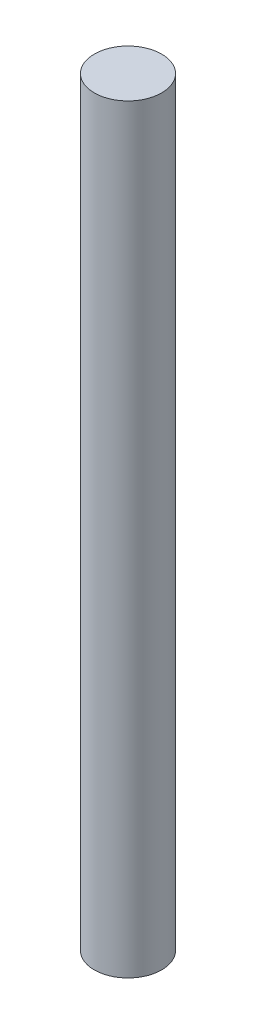
ISO-10303-21;
HEADER;
FILE_DESCRIPTION(('STEP AP214'),'2;1');
FILE_NAME('part.step','',(''),(''),'','','');
FILE_SCHEMA(('AUTOMOTIVE_DESIGN { 1 0 10303 214 1 1 1 1 }'));
ENDSEC;
DATA;
#1=APPLICATION_CONTEXT('core data for automotive mechanical design processes');
#2=APPLICATION_PROTOCOL_DEFINITION('international standard','automotive_design',2000,#1);
#3=PRODUCT_CONTEXT('',#1,'mechanical');
#4=PRODUCT('Part','Part','',(#3));
#5=PRODUCT_RELATED_PRODUCT_CATEGORY('part','',(#4));
#6=PRODUCT_DEFINITION_FORMATION('','',#4);
#7=PRODUCT_DEFINITION_CONTEXT('part definition',#1,'design');
#8=PRODUCT_DEFINITION('design','',#6,#7);
#9=PRODUCT_DEFINITION_SHAPE('','',#8);
#10=(LENGTH_UNIT() NAMED_UNIT(*) SI_UNIT(.MILLI.,.METRE.));
#11=(NAMED_UNIT(*) PLANE_ANGLE_UNIT() SI_UNIT($,.RADIAN.));
#12=(NAMED_UNIT(*) SI_UNIT($,.STERADIAN.) SOLID_ANGLE_UNIT());
#13=UNCERTAINTY_MEASURE_WITH_UNIT(LENGTH_MEASURE(1.E-05),#10,'distance_accuracy_value','');
#14=(GEOMETRIC_REPRESENTATION_CONTEXT(3) GLOBAL_UNCERTAINTY_ASSIGNED_CONTEXT((#13)) GLOBAL_UNIT_ASSIGNED_CONTEXT((#10,
#11,#12)) REPRESENTATION_CONTEXT('',''));
#15=CARTESIAN_POINT('',(0.,0.,0.));
#16=DIRECTION('',(0.,0.,1.));
#17=DIRECTION('',(1.,0.,0.));
#18=AXIS2_PLACEMENT_3D('',#15,#16,#17);
#19=CARTESIAN_POINT('',(0.,88.,0.));
#20=DIRECTION('',(0.,-1.,0.));
#21=DIRECTION('',(0.,0.,-1.));
#22=AXIS2_PLACEMENT_3D('',#19,#20,#21);
#23=CYLINDRICAL_SURFACE('',#22,3.9);
#24=CARTESIAN_POINT('',(0.,88.,0.));
#25=DIRECTION('',(0.,1.,0.));
#26=DIRECTION('',(0.,0.,1.));
#27=AXIS2_PLACEMENT_3D('',#24,#25,#26);
#28=CIRCLE('',#27,3.9);
#29=CARTESIAN_POINT('',(0.,88.,3.9));
#30=VERTEX_POINT('',#29);
#31=EDGE_CURVE('E10',#30,#30,#28,.T.);
#32=ORIENTED_EDGE('',*,*,#31,.F.);
#33=EDGE_LOOP('',(#32));
#34=FACE_BOUND('',#33,.T.);
#35=CARTESIAN_POINT('',(0.,0.,0.));
#36=DIRECTION('',(0.,1.,0.));
#37=DIRECTION('',(0.,0.,1.));
#38=AXIS2_PLACEMENT_3D('',#35,#36,#37);
#39=CIRCLE('',#38,3.9);
#40=CARTESIAN_POINT('',(0.,0.,3.9));
#41=VERTEX_POINT('',#40);
#42=EDGE_CURVE('E36',#41,#41,#39,.T.);
#43=ORIENTED_EDGE('',*,*,#42,.T.);
#44=EDGE_LOOP('',(#43));
#45=FACE_BOUND('',#44,.T.);
#46=ADVANCED_FACE('F33',(#34,#45),#23,.T.);
#47=CARTESIAN_POINT('',(0.,88.,0.));
#48=DIRECTION('',(0.,1.,0.));
#49=DIRECTION('',(0.,0.,1.));
#50=AXIS2_PLACEMENT_3D('',#47,#48,#49);
#51=PLANE('',#50);
#52=ORIENTED_EDGE('',*,*,#31,.T.);
#53=EDGE_LOOP('',(#52));
#54=FACE_BOUND('',#53,.T.);
#55=ADVANCED_FACE('F48',(#54),#51,.T.);
#56=CARTESIAN_POINT('',(0.,0.,0.));
#57=DIRECTION('',(0.,1.,0.));
#58=DIRECTION('',(0.,0.,1.));
#59=AXIS2_PLACEMENT_3D('',#56,#57,#58);
#60=PLANE('',#59);
#61=ORIENTED_EDGE('',*,*,#42,.F.);
#62=EDGE_LOOP('',(#61));
#63=FACE_BOUND('',#62,.T.);
#64=ADVANCED_FACE('F46',(#63),#60,.F.);
#65=CLOSED_SHELL('',(#46,#55,#64));
#66=MANIFOLD_SOLID_BREP('B2',#65);
#67=ADVANCED_BREP_SHAPE_REPRESENTATION('',(#18,#66),#14);
#68=SHAPE_DEFINITION_REPRESENTATION(#9,#67);
ENDSEC;
END-ISO-10303-21;
